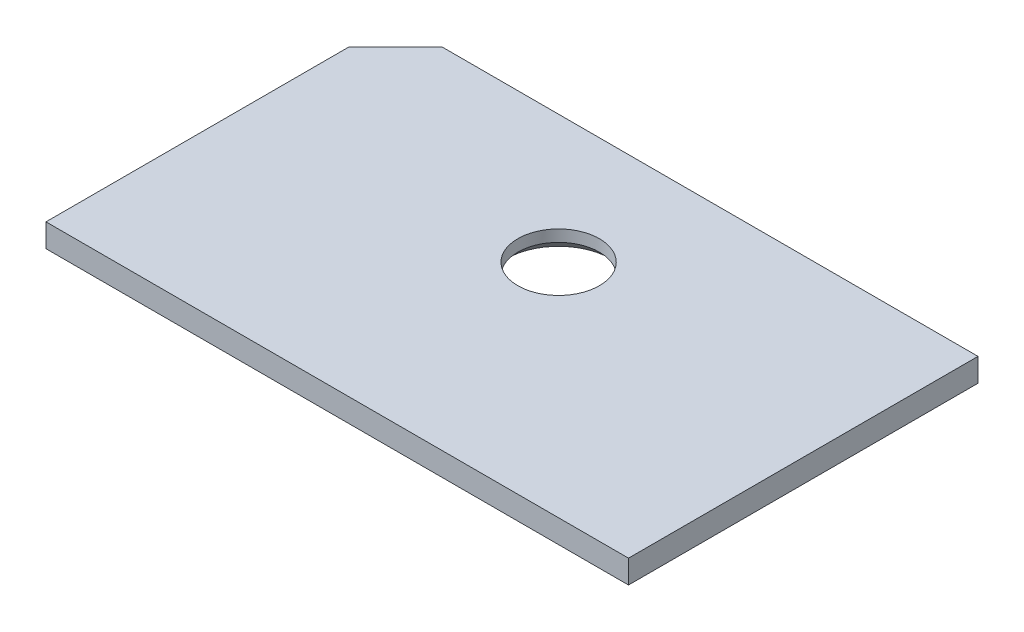
ISO-10303-21;
HEADER;
FILE_DESCRIPTION(('STEP AP214'),'2;1');
FILE_NAME('part.step','',(''),(''),'','','');
FILE_SCHEMA(('AUTOMOTIVE_DESIGN { 1 0 10303 214 1 1 1 1 }'));
ENDSEC;
DATA;
#1=APPLICATION_CONTEXT('core data for automotive mechanical design processes');
#2=APPLICATION_PROTOCOL_DEFINITION('international standard','automotive_design',2000,#1);
#3=PRODUCT_CONTEXT('',#1,'mechanical');
#4=PRODUCT('Part','Part','',(#3));
#5=PRODUCT_RELATED_PRODUCT_CATEGORY('part','',(#4));
#6=PRODUCT_DEFINITION_FORMATION('','',#4);
#7=PRODUCT_DEFINITION_CONTEXT('part definition',#1,'design');
#8=PRODUCT_DEFINITION('design','',#6,#7);
#9=PRODUCT_DEFINITION_SHAPE('','',#8);
#10=(LENGTH_UNIT() NAMED_UNIT(*) SI_UNIT(.MILLI.,.METRE.));
#11=(NAMED_UNIT(*) PLANE_ANGLE_UNIT() SI_UNIT($,.RADIAN.));
#12=(NAMED_UNIT(*) SI_UNIT($,.STERADIAN.) SOLID_ANGLE_UNIT());
#13=UNCERTAINTY_MEASURE_WITH_UNIT(LENGTH_MEASURE(1.E-05),#10,'distance_accuracy_value','');
#14=(GEOMETRIC_REPRESENTATION_CONTEXT(3) GLOBAL_UNCERTAINTY_ASSIGNED_CONTEXT((#13)) GLOBAL_UNIT_ASSIGNED_CONTEXT((#10,
#11,#12)) REPRESENTATION_CONTEXT('',''));
#15=CARTESIAN_POINT('',(0.,0.,0.));
#16=DIRECTION('',(0.,0.,1.));
#17=DIRECTION('',(1.,0.,0.));
#18=AXIS2_PLACEMENT_3D('',#15,#16,#17);
#19=CARTESIAN_POINT('',(0.,5.6843418860808E-11,-2.));
#20=DIRECTION('',(0.,-1.,0.));
#21=DIRECTION('',(0.,0.,-1.));
#22=AXIS2_PLACEMENT_3D('',#19,#20,#21);
#23=CONICAL_SURFACE('',#22,2.2499999998995,0.785398163397448);
#24=CARTESIAN_POINT('',(0.,0.500000000000003,-2.));
#25=DIRECTION('',(0.,1.,0.));
#26=DIRECTION('',(0.,0.,1.));
#27=AXIS2_PLACEMENT_3D('',#24,#25,#26);
#28=CIRCLE('',#27,1.75);
#29=CARTESIAN_POINT('',(0.,0.500000000000003,-0.25));
#30=VERTEX_POINT('',#29);
#31=EDGE_CURVE('E73',#30,#30,#28,.T.);
#32=ORIENTED_EDGE('',*,*,#31,.T.);
#33=EDGE_LOOP('',(#32));
#34=FACE_BOUND('',#33,.T.);
#35=CARTESIAN_POINT('',(0.,0.,-2.));
#36=DIRECTION('',(0.,-1.,0.));
#37=DIRECTION('',(0.,0.,-1.));
#38=AXIS2_PLACEMENT_3D('',#35,#36,#37);
#39=CIRCLE('',#38,2.24999999995634);
#40=CARTESIAN_POINT('',(0.,0.,-4.24999999995634));
#41=VERTEX_POINT('',#40);
#42=EDGE_CURVE('E20',#41,#41,#39,.F.);
#43=ORIENTED_EDGE('',*,*,#42,.F.);
#44=EDGE_LOOP('',(#43));
#45=FACE_BOUND('',#44,.T.);
#46=ADVANCED_FACE('F17',(#34,#45),#23,.F.);
#47=CARTESIAN_POINT('',(0.,0.,0.));
#48=DIRECTION('',(0.,-1.,0.));
#49=DIRECTION('',(0.,0.,-1.));
#50=AXIS2_PLACEMENT_3D('',#47,#48,#49);
#51=PLANE('',#50);
#52=DIRECTION('',(0.,0.,1.));
#53=VECTOR('',#52,1.);
#54=CARTESIAN_POINT('',(12.5,0.,7.5));
#55=LINE('',#54,#53);
#56=CARTESIAN_POINT('',(12.5,0.,-7.5));
#57=VERTEX_POINT('',#56);
#58=CARTESIAN_POINT('',(12.5,0.,7.5));
#59=VERTEX_POINT('',#58);
#60=EDGE_CURVE('E64',#57,#59,#55,.T.);
#61=ORIENTED_EDGE('',*,*,#60,.T.);
#62=DIRECTION('',(-1.,0.,0.));
#63=VECTOR('',#62,1.);
#64=CARTESIAN_POINT('',(-12.5,0.,7.5));
#65=LINE('',#64,#63);
#66=CARTESIAN_POINT('',(-12.5,0.,7.5));
#67=VERTEX_POINT('',#66);
#68=EDGE_CURVE('E61',#59,#67,#65,.T.);
#69=ORIENTED_EDGE('',*,*,#68,.T.);
#70=DIRECTION('',(0.,0.,-1.));
#71=VECTOR('',#70,1.);
#72=CARTESIAN_POINT('',(-12.5,0.,7.5));
#73=LINE('',#72,#71);
#74=CARTESIAN_POINT('',(-12.5,0.,-5.5));
#75=VERTEX_POINT('',#74);
#76=EDGE_CURVE('E106',#67,#75,#73,.T.);
#77=ORIENTED_EDGE('',*,*,#76,.T.);
#78=DIRECTION('',(0.707106781186549,0.,-0.707106781186546));
#79=VECTOR('',#78,1.);
#80=CARTESIAN_POINT('',(-12.5,0.,-5.5));
#81=LINE('',#80,#79);
#82=CARTESIAN_POINT('',(-10.5,0.,-7.5));
#83=VERTEX_POINT('',#82);
#84=EDGE_CURVE('E101',#75,#83,#81,.T.);
#85=ORIENTED_EDGE('',*,*,#84,.T.);
#86=DIRECTION('',(1.,0.,0.));
#87=VECTOR('',#86,1.);
#88=CARTESIAN_POINT('',(-12.5,0.,-7.5));
#89=LINE('',#88,#87);
#90=EDGE_CURVE('E67',#83,#57,#89,.T.);
#91=ORIENTED_EDGE('',*,*,#90,.T.);
#92=EDGE_LOOP('',(#61,#69,#77,#85,#91));
#93=FACE_BOUND('',#92,.T.);
#94=ORIENTED_EDGE('',*,*,#42,.T.);
#95=EDGE_LOOP('',(#94));
#96=FACE_BOUND('',#95,.T.);
#97=ADVANCED_FACE('F65',(#93,#96),#51,.T.);
#98=CARTESIAN_POINT('',(0.,0.,-2.));
#99=DIRECTION('',(0.,1.,0.));
#100=DIRECTION('',(0.,0.,1.));
#101=AXIS2_PLACEMENT_3D('',#98,#99,#100);
#102=CYLINDRICAL_SURFACE('',#101,1.75);
#103=ORIENTED_EDGE('',*,*,#31,.F.);
#104=EDGE_LOOP('',(#103));
#105=FACE_BOUND('',#104,.T.);
#106=CARTESIAN_POINT('',(0.,1.,-2.));
#107=DIRECTION('',(0.,1.,0.));
#108=DIRECTION('',(0.,0.,1.));
#109=AXIS2_PLACEMENT_3D('',#106,#107,#108);
#110=CIRCLE('',#109,1.75);
#111=CARTESIAN_POINT('',(0.,1.,-0.25));
#112=VERTEX_POINT('',#111);
#113=EDGE_CURVE('E89',#112,#112,#110,.T.);
#114=ORIENTED_EDGE('',*,*,#113,.T.);
#115=EDGE_LOOP('',(#114));
#116=FACE_BOUND('',#115,.T.);
#117=ADVANCED_FACE('F139',(#105,#116),#102,.F.);
#118=CARTESIAN_POINT('',(12.5,1.,7.5));
#119=DIRECTION('',(-1.,0.,0.));
#120=DIRECTION('',(0.,0.,1.));
#121=AXIS2_PLACEMENT_3D('',#118,#119,#120);
#122=PLANE('',#121);
#123=DIRECTION('',(0.,1.,0.));
#124=VECTOR('',#123,1.);
#125=CARTESIAN_POINT('',(12.5,1.,-7.5));
#126=LINE('',#125,#124);
#127=CARTESIAN_POINT('',(12.5,1.,-7.5));
#128=VERTEX_POINT('',#127);
#129=EDGE_CURVE('E96',#57,#128,#126,.T.);
#130=ORIENTED_EDGE('',*,*,#129,.T.);
#131=DIRECTION('',(0.,0.,-1.));
#132=VECTOR('',#131,1.);
#133=CARTESIAN_POINT('',(12.5,1.,0.));
#134=LINE('',#133,#132);
#135=CARTESIAN_POINT('',(12.5,1.,7.5));
#136=VERTEX_POINT('',#135);
#137=EDGE_CURVE('E84',#128,#136,#134,.F.);
#138=ORIENTED_EDGE('',*,*,#137,.T.);
#139=DIRECTION('',(0.,1.,0.));
#140=VECTOR('',#139,1.);
#141=CARTESIAN_POINT('',(12.5,1.,7.5));
#142=LINE('',#141,#140);
#143=EDGE_CURVE('E72',#136,#59,#142,.F.);
#144=ORIENTED_EDGE('',*,*,#143,.T.);
#145=ORIENTED_EDGE('',*,*,#60,.F.);
#146=EDGE_LOOP('',(#130,#138,#144,#145));
#147=FACE_BOUND('',#146,.T.);
#148=ADVANCED_FACE('F83',(#147),#122,.F.);
#149=CARTESIAN_POINT('',(-12.5,1.,7.5));
#150=DIRECTION('',(0.,0.,-1.));
#151=DIRECTION('',(-1.,0.,0.));
#152=AXIS2_PLACEMENT_3D('',#149,#150,#151);
#153=PLANE('',#152);
#154=ORIENTED_EDGE('',*,*,#143,.F.);
#155=DIRECTION('',(1.,0.,0.));
#156=VECTOR('',#155,1.);
#157=CARTESIAN_POINT('',(0.,1.,7.5));
#158=LINE('',#157,#156);
#159=CARTESIAN_POINT('',(-12.5,1.,7.5));
#160=VERTEX_POINT('',#159);
#161=EDGE_CURVE('E93',#136,#160,#158,.F.);
#162=ORIENTED_EDGE('',*,*,#161,.T.);
#163=DIRECTION('',(0.,1.,0.));
#164=VECTOR('',#163,1.);
#165=CARTESIAN_POINT('',(-12.5,1.,7.5));
#166=LINE('',#165,#164);
#167=EDGE_CURVE('E80',#160,#67,#166,.F.);
#168=ORIENTED_EDGE('',*,*,#167,.T.);
#169=ORIENTED_EDGE('',*,*,#68,.F.);
#170=EDGE_LOOP('',(#154,#162,#168,#169));
#171=FACE_BOUND('',#170,.T.);
#172=ADVANCED_FACE('F77',(#171),#153,.F.);
#173=CARTESIAN_POINT('',(-12.5,1.,7.5));
#174=DIRECTION('',(1.,0.,0.));
#175=DIRECTION('',(0.,0.,-1.));
#176=AXIS2_PLACEMENT_3D('',#173,#174,#175);
#177=PLANE('',#176);
#178=DIRECTION('',(0.,1.,0.));
#179=VECTOR('',#178,1.);
#180=CARTESIAN_POINT('',(-12.5,1.,-5.5));
#181=LINE('',#180,#179);
#182=CARTESIAN_POINT('',(-12.5,1.,-5.5));
#183=VERTEX_POINT('',#182);
#184=EDGE_CURVE('E103',#183,#75,#181,.F.);
#185=ORIENTED_EDGE('',*,*,#184,.T.);
#186=ORIENTED_EDGE('',*,*,#76,.F.);
#187=ORIENTED_EDGE('',*,*,#167,.F.);
#188=DIRECTION('',(0.,0.,-1.));
#189=VECTOR('',#188,1.);
#190=CARTESIAN_POINT('',(-12.5,1.,0.));
#191=LINE('',#190,#189);
#192=EDGE_CURVE('E116',#160,#183,#191,.T.);
#193=ORIENTED_EDGE('',*,*,#192,.T.);
#194=EDGE_LOOP('',(#185,#186,#187,#193));
#195=FACE_BOUND('',#194,.T.);
#196=ADVANCED_FACE('F114',(#195),#177,.F.);
#197=CARTESIAN_POINT('',(-12.5,1.,-5.5));
#198=DIRECTION('',(0.707106781186546,0.,0.707106781186549));
#199=DIRECTION('',(0.707106781186549,0.,-0.707106781186546));
#200=AXIS2_PLACEMENT_3D('',#197,#198,#199);
#201=PLANE('',#200);
#202=DIRECTION('',(0.,1.,0.));
#203=VECTOR('',#202,1.);
#204=CARTESIAN_POINT('',(-10.5,1.,-7.5));
#205=LINE('',#204,#203);
#206=CARTESIAN_POINT('',(-10.5,1.,-7.5));
#207=VERTEX_POINT('',#206);
#208=EDGE_CURVE('E34',#207,#83,#205,.F.);
#209=ORIENTED_EDGE('',*,*,#208,.T.);
#210=ORIENTED_EDGE('',*,*,#84,.F.);
#211=ORIENTED_EDGE('',*,*,#184,.F.);
#212=DIRECTION('',(0.70710678118655,0.,-0.707106781186545));
#213=VECTOR('',#212,1.);
#214=CARTESIAN_POINT('',(-12.5,1.,-5.5));
#215=LINE('',#214,#213);
#216=EDGE_CURVE('E26',#183,#207,#215,.T.);
#217=ORIENTED_EDGE('',*,*,#216,.T.);
#218=EDGE_LOOP('',(#209,#210,#211,#217));
#219=FACE_BOUND('',#218,.T.);
#220=ADVANCED_FACE('F110',(#219),#201,.F.);
#221=CARTESIAN_POINT('',(-12.5,1.,-7.5));
#222=DIRECTION('',(0.,0.,1.));
#223=DIRECTION('',(1.,0.,0.));
#224=AXIS2_PLACEMENT_3D('',#221,#222,#223);
#225=PLANE('',#224);
#226=ORIENTED_EDGE('',*,*,#208,.F.);
#227=DIRECTION('',(1.,0.,0.));
#228=VECTOR('',#227,1.);
#229=CARTESIAN_POINT('',(0.,1.,-7.5));
#230=LINE('',#229,#228);
#231=EDGE_CURVE('E11',#207,#128,#230,.T.);
#232=ORIENTED_EDGE('',*,*,#231,.T.);
#233=ORIENTED_EDGE('',*,*,#129,.F.);
#234=ORIENTED_EDGE('',*,*,#90,.F.);
#235=EDGE_LOOP('',(#226,#232,#233,#234));
#236=FACE_BOUND('',#235,.T.);
#237=ADVANCED_FACE('F122',(#236),#225,.F.);
#238=CARTESIAN_POINT('',(0.,1.,0.));
#239=DIRECTION('',(0.,-1.,0.));
#240=DIRECTION('',(0.,0.,-1.));
#241=AXIS2_PLACEMENT_3D('',#238,#239,#240);
#242=PLANE('',#241);
#243=ORIENTED_EDGE('',*,*,#216,.F.);
#244=ORIENTED_EDGE('',*,*,#192,.F.);
#245=ORIENTED_EDGE('',*,*,#161,.F.);
#246=ORIENTED_EDGE('',*,*,#137,.F.);
#247=ORIENTED_EDGE('',*,*,#231,.F.);
#248=EDGE_LOOP('',(#243,#244,#245,#246,#247));
#249=FACE_BOUND('',#248,.T.);
#250=ORIENTED_EDGE('',*,*,#113,.F.);
#251=EDGE_LOOP('',(#250));
#252=FACE_BOUND('',#251,.T.);
#253=ADVANCED_FACE('F120',(#249,#252),#242,.F.);
#254=CLOSED_SHELL('',(#46,#97,#117,#148,#172,#196,#220,#237,#253));
#255=MANIFOLD_SOLID_BREP('B1',#254);
#256=ADVANCED_BREP_SHAPE_REPRESENTATION('',(#18,#255),#14);
#257=SHAPE_DEFINITION_REPRESENTATION(#9,#256);
ENDSEC;
END-ISO-10303-21;
